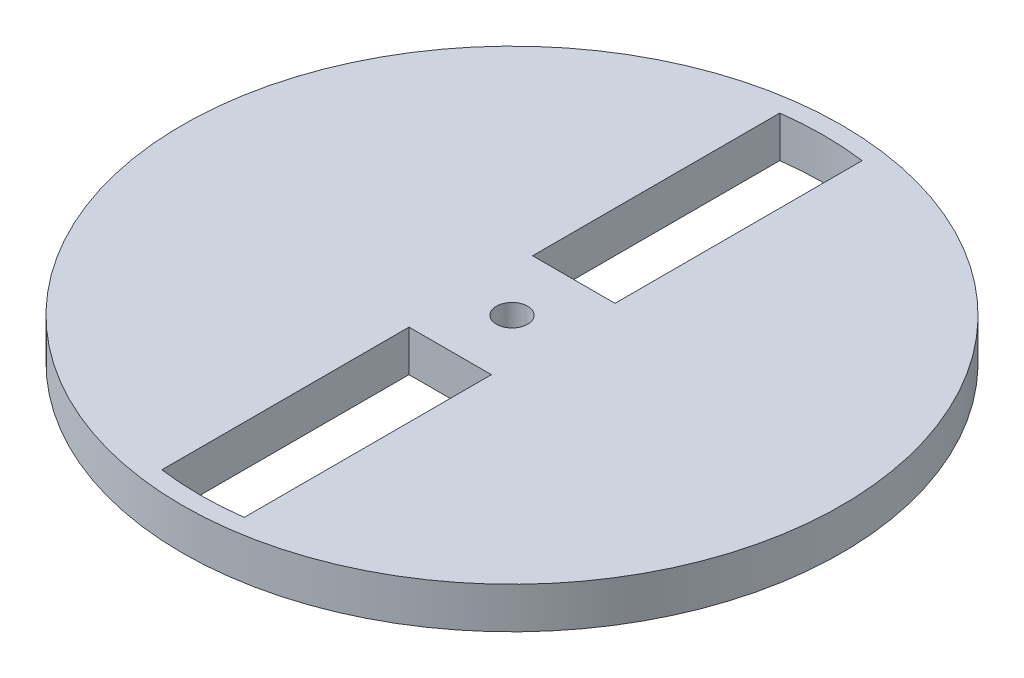
ISO-10303-21;
HEADER;
FILE_DESCRIPTION(('STEP AP214'),'2;1');
FILE_NAME('part.step','',(''),(''),'','','');
FILE_SCHEMA(('AUTOMOTIVE_DESIGN { 1 0 10303 214 1 1 1 1 }'));
ENDSEC;
DATA;
#1=APPLICATION_CONTEXT('core data for automotive mechanical design processes');
#2=APPLICATION_PROTOCOL_DEFINITION('international standard','automotive_design',2000,#1);
#3=PRODUCT_CONTEXT('',#1,'mechanical');
#4=PRODUCT('Part','Part','',(#3));
#5=PRODUCT_RELATED_PRODUCT_CATEGORY('part','',(#4));
#6=PRODUCT_DEFINITION_FORMATION('','',#4);
#7=PRODUCT_DEFINITION_CONTEXT('part definition',#1,'design');
#8=PRODUCT_DEFINITION('design','',#6,#7);
#9=PRODUCT_DEFINITION_SHAPE('','',#8);
#10=(LENGTH_UNIT() NAMED_UNIT(*) SI_UNIT(.MILLI.,.METRE.));
#11=(NAMED_UNIT(*) PLANE_ANGLE_UNIT() SI_UNIT($,.RADIAN.));
#12=(NAMED_UNIT(*) SI_UNIT($,.STERADIAN.) SOLID_ANGLE_UNIT());
#13=UNCERTAINTY_MEASURE_WITH_UNIT(LENGTH_MEASURE(1.E-05),#10,'distance_accuracy_value','');
#14=(GEOMETRIC_REPRESENTATION_CONTEXT(3) GLOBAL_UNCERTAINTY_ASSIGNED_CONTEXT((#13)) GLOBAL_UNIT_ASSIGNED_CONTEXT((#10,
#11,#12)) REPRESENTATION_CONTEXT('',''));
#15=CARTESIAN_POINT('',(0.,0.,0.));
#16=DIRECTION('',(0.,0.,1.));
#17=DIRECTION('',(1.,0.,0.));
#18=AXIS2_PLACEMENT_3D('',#15,#16,#17);
#19=CARTESIAN_POINT('',(0.,2.5,0.));
#20=DIRECTION('',(0.,1.,0.));
#21=DIRECTION('',(0.,0.,1.));
#22=AXIS2_PLACEMENT_3D('',#19,#20,#21);
#23=PLANE('',#22);
#24=CARTESIAN_POINT('',(0.,2.5,0.));
#25=DIRECTION('',(0.,1.,0.));
#26=DIRECTION('',(0.,0.,1.));
#27=AXIS2_PLACEMENT_3D('',#24,#25,#26);
#28=CIRCLE('',#27,20.);
#29=CARTESIAN_POINT('',(0.,2.5,20.));
#30=VERTEX_POINT('',#29);
#31=EDGE_CURVE('E13',#30,#30,#28,.T.);
#32=ORIENTED_EDGE('',*,*,#31,.T.);
#33=EDGE_LOOP('',(#32));
#34=FACE_BOUND('',#33,.T.);
#35=CARTESIAN_POINT('',(0.,2.5,0.));
#36=DIRECTION('',(0.,1.,0.));
#37=DIRECTION('',(0.,0.,1.));
#38=AXIS2_PLACEMENT_3D('',#35,#36,#37);
#39=CIRCLE('',#38,0.95);
#40=CARTESIAN_POINT('',(0.,2.5,0.95));
#41=VERTEX_POINT('',#40);
#42=EDGE_CURVE('E206',#41,#41,#39,.T.);
#43=ORIENTED_EDGE('',*,*,#42,.F.);
#44=EDGE_LOOP('',(#43));
#45=FACE_BOUND('',#44,.T.);
#46=DIRECTION('',(0.,0.,1.));
#47=VECTOR('',#46,1.);
#48=CARTESIAN_POINT('',(-2.5,2.5,-3.75));
#49=LINE('',#48,#47);
#50=CARTESIAN_POINT('',(-2.5,2.5,-18.75));
#51=VERTEX_POINT('',#50);
#52=CARTESIAN_POINT('',(-2.5,2.5,-3.75));
#53=VERTEX_POINT('',#52);
#54=EDGE_CURVE('E166',#51,#53,#49,.T.);
#55=ORIENTED_EDGE('',*,*,#54,.F.);
#56=CARTESIAN_POINT('',(0.,2.5,0.));
#57=DIRECTION('',(0.,1.,0.));
#58=DIRECTION('',(0.,0.,-1.));
#59=AXIS2_PLACEMENT_3D('',#56,#57,#58);
#60=CIRCLE('',#59,18.9159324380269);
#61=CARTESIAN_POINT('',(2.5,2.5,-18.75));
#62=VERTEX_POINT('',#61);
#63=EDGE_CURVE('E163',#62,#51,#60,.T.);
#64=ORIENTED_EDGE('',*,*,#63,.F.);
#65=DIRECTION('',(0.,0.,-1.));
#66=VECTOR('',#65,1.);
#67=CARTESIAN_POINT('',(2.5,2.5,-3.75));
#68=LINE('',#67,#66);
#69=CARTESIAN_POINT('',(2.5,2.5,-3.75));
#70=VERTEX_POINT('',#69);
#71=EDGE_CURVE('E174',#70,#62,#68,.T.);
#72=ORIENTED_EDGE('',*,*,#71,.F.);
#73=DIRECTION('',(1.,0.,0.));
#74=VECTOR('',#73,1.);
#75=CARTESIAN_POINT('',(-2.5,2.5,-3.75));
#76=LINE('',#75,#74);
#77=EDGE_CURVE('E170',#53,#70,#76,.T.);
#78=ORIENTED_EDGE('',*,*,#77,.F.);
#79=EDGE_LOOP('',(#55,#64,#72,#78));
#80=FACE_BOUND('',#79,.T.);
#81=DIRECTION('',(0.,0.,-1.));
#82=VECTOR('',#81,1.);
#83=CARTESIAN_POINT('',(2.5,2.5,3.75));
#84=LINE('',#83,#82);
#85=CARTESIAN_POINT('',(2.5,2.5,18.75));
#86=VERTEX_POINT('',#85);
#87=CARTESIAN_POINT('',(2.5,2.5,3.75));
#88=VERTEX_POINT('',#87);
#89=EDGE_CURVE('E124',#86,#88,#84,.T.);
#90=ORIENTED_EDGE('',*,*,#89,.F.);
#91=CARTESIAN_POINT('',(0.,2.5,0.));
#92=DIRECTION('',(0.,1.,0.));
#93=DIRECTION('',(0.,0.,1.));
#94=AXIS2_PLACEMENT_3D('',#91,#92,#93);
#95=CIRCLE('',#94,18.9159324380269);
#96=CARTESIAN_POINT('',(-2.5,2.5,18.75));
#97=VERTEX_POINT('',#96);
#98=EDGE_CURVE('E115',#97,#86,#95,.T.);
#99=ORIENTED_EDGE('',*,*,#98,.F.);
#100=DIRECTION('',(0.,0.,1.));
#101=VECTOR('',#100,1.);
#102=CARTESIAN_POINT('',(-2.5,2.5,3.75));
#103=LINE('',#102,#101);
#104=CARTESIAN_POINT('',(-2.5,2.5,3.75));
#105=VERTEX_POINT('',#104);
#106=EDGE_CURVE('E141',#105,#97,#103,.T.);
#107=ORIENTED_EDGE('',*,*,#106,.F.);
#108=DIRECTION('',(-1.,0.,0.));
#109=VECTOR('',#108,1.);
#110=CARTESIAN_POINT('',(-2.5,2.5,3.75));
#111=LINE('',#110,#109);
#112=EDGE_CURVE('E137',#88,#105,#111,.T.);
#113=ORIENTED_EDGE('',*,*,#112,.F.);
#114=EDGE_LOOP('',(#90,#99,#107,#113));
#115=FACE_BOUND('',#114,.T.);
#116=ADVANCED_FACE('F49',(#34,#45,#80,#115),#23,.T.);
#117=CARTESIAN_POINT('',(0.,0.,0.));
#118=DIRECTION('',(0.,1.,0.));
#119=DIRECTION('',(0.,0.,1.));
#120=AXIS2_PLACEMENT_3D('',#117,#118,#119);
#121=PLANE('',#120);
#122=CARTESIAN_POINT('',(0.,0.,0.));
#123=DIRECTION('',(0.,1.,0.));
#124=DIRECTION('',(0.,0.,-1.));
#125=AXIS2_PLACEMENT_3D('',#122,#123,#124);
#126=CIRCLE('',#125,18.9159324380269);
#127=CARTESIAN_POINT('',(2.5,0.,-18.75));
#128=VERTEX_POINT('',#127);
#129=CARTESIAN_POINT('',(-2.5,0.,-18.75));
#130=VERTEX_POINT('',#129);
#131=EDGE_CURVE('E133',#128,#130,#126,.T.);
#132=ORIENTED_EDGE('',*,*,#131,.T.);
#133=DIRECTION('',(0.,0.,1.));
#134=VECTOR('',#133,1.);
#135=CARTESIAN_POINT('',(-2.5,0.,-3.75));
#136=LINE('',#135,#134);
#137=CARTESIAN_POINT('',(-2.5,0.,-3.75));
#138=VERTEX_POINT('',#137);
#139=EDGE_CURVE('E181',#130,#138,#136,.T.);
#140=ORIENTED_EDGE('',*,*,#139,.T.);
#141=DIRECTION('',(1.,0.,0.));
#142=VECTOR('',#141,1.);
#143=CARTESIAN_POINT('',(-2.5,0.,-3.75));
#144=LINE('',#143,#142);
#145=CARTESIAN_POINT('',(2.5,0.,-3.75));
#146=VERTEX_POINT('',#145);
#147=EDGE_CURVE('E185',#138,#146,#144,.T.);
#148=ORIENTED_EDGE('',*,*,#147,.T.);
#149=DIRECTION('',(0.,0.,-1.));
#150=VECTOR('',#149,1.);
#151=CARTESIAN_POINT('',(2.5,0.,-3.75));
#152=LINE('',#151,#150);
#153=EDGE_CURVE('E167',#146,#128,#152,.T.);
#154=ORIENTED_EDGE('',*,*,#153,.T.);
#155=EDGE_LOOP('',(#132,#140,#148,#154));
#156=FACE_BOUND('',#155,.T.);
#157=CARTESIAN_POINT('',(0.,0.,0.));
#158=DIRECTION('',(0.,1.,0.));
#159=DIRECTION('',(0.,0.,1.));
#160=AXIS2_PLACEMENT_3D('',#157,#158,#159);
#161=CIRCLE('',#160,20.);
#162=CARTESIAN_POINT('',(0.,0.,20.));
#163=VERTEX_POINT('',#162);
#164=EDGE_CURVE('E53',#163,#163,#161,.T.);
#165=ORIENTED_EDGE('',*,*,#164,.F.);
#166=EDGE_LOOP('',(#165));
#167=FACE_BOUND('',#166,.T.);
#168=CARTESIAN_POINT('',(0.,0.,0.));
#169=DIRECTION('',(0.,1.,0.));
#170=DIRECTION('',(0.,0.,1.));
#171=AXIS2_PLACEMENT_3D('',#168,#169,#170);
#172=CIRCLE('',#171,0.95);
#173=CARTESIAN_POINT('',(0.,0.,0.95));
#174=VERTEX_POINT('',#173);
#175=EDGE_CURVE('E205',#174,#174,#172,.T.);
#176=ORIENTED_EDGE('',*,*,#175,.T.);
#177=EDGE_LOOP('',(#176));
#178=FACE_BOUND('',#177,.T.);
#179=CARTESIAN_POINT('',(0.,0.,0.));
#180=DIRECTION('',(0.,1.,0.));
#181=DIRECTION('',(0.,0.,1.));
#182=AXIS2_PLACEMENT_3D('',#179,#180,#181);
#183=CIRCLE('',#182,18.9159324380269);
#184=CARTESIAN_POINT('',(-2.5,0.,18.75));
#185=VERTEX_POINT('',#184);
#186=CARTESIAN_POINT('',(2.5,0.,18.75));
#187=VERTEX_POINT('',#186);
#188=EDGE_CURVE('E73',#185,#187,#183,.T.);
#189=ORIENTED_EDGE('',*,*,#188,.T.);
#190=DIRECTION('',(0.,0.,-1.));
#191=VECTOR('',#190,1.);
#192=CARTESIAN_POINT('',(2.5,0.,3.75));
#193=LINE('',#192,#191);
#194=CARTESIAN_POINT('',(2.5,0.,3.75));
#195=VERTEX_POINT('',#194);
#196=EDGE_CURVE('E131',#187,#195,#193,.T.);
#197=ORIENTED_EDGE('',*,*,#196,.T.);
#198=DIRECTION('',(-1.,0.,0.));
#199=VECTOR('',#198,1.);
#200=CARTESIAN_POINT('',(-2.5,0.,3.75));
#201=LINE('',#200,#199);
#202=CARTESIAN_POINT('',(-2.5,0.,3.75));
#203=VERTEX_POINT('',#202);
#204=EDGE_CURVE('E150',#195,#203,#201,.T.);
#205=ORIENTED_EDGE('',*,*,#204,.T.);
#206=DIRECTION('',(0.,0.,1.));
#207=VECTOR('',#206,1.);
#208=CARTESIAN_POINT('',(-2.5,0.,3.75));
#209=LINE('',#208,#207);
#210=EDGE_CURVE('E125',#203,#185,#209,.T.);
#211=ORIENTED_EDGE('',*,*,#210,.T.);
#212=EDGE_LOOP('',(#189,#197,#205,#211));
#213=FACE_BOUND('',#212,.T.);
#214=ADVANCED_FACE('F214',(#156,#167,#178,#213),#121,.F.);
#215=CARTESIAN_POINT('',(0.,2.5,0.));
#216=DIRECTION('',(0.,-1.,0.));
#217=DIRECTION('',(0.,0.,-1.));
#218=AXIS2_PLACEMENT_3D('',#215,#216,#217);
#219=CYLINDRICAL_SURFACE('',#218,20.);
#220=ORIENTED_EDGE('',*,*,#31,.F.);
#221=EDGE_LOOP('',(#220));
#222=FACE_BOUND('',#221,.T.);
#223=ORIENTED_EDGE('',*,*,#164,.T.);
#224=EDGE_LOOP('',(#223));
#225=FACE_BOUND('',#224,.T.);
#226=ADVANCED_FACE('F51',(#222,#225),#219,.T.);
#227=CARTESIAN_POINT('',(0.,2.5,0.));
#228=DIRECTION('',(0.,-1.,0.));
#229=DIRECTION('',(0.,0.,-1.));
#230=AXIS2_PLACEMENT_3D('',#227,#228,#229);
#231=CYLINDRICAL_SURFACE('',#230,0.95);
#232=ORIENTED_EDGE('',*,*,#42,.T.);
#233=EDGE_LOOP('',(#232));
#234=FACE_BOUND('',#233,.T.);
#235=ORIENTED_EDGE('',*,*,#175,.F.);
#236=EDGE_LOOP('',(#235));
#237=FACE_BOUND('',#236,.T.);
#238=ADVANCED_FACE('F217',(#234,#237),#231,.F.);
#239=CARTESIAN_POINT('',(0.,2.5,0.));
#240=DIRECTION('',(0.,-1.,0.));
#241=DIRECTION('',(0.,0.,-1.));
#242=AXIS2_PLACEMENT_3D('',#239,#240,#241);
#243=CYLINDRICAL_SURFACE('',#242,18.9159324380269);
#244=ORIENTED_EDGE('',*,*,#131,.F.);
#245=DIRECTION('',(0.,-1.,0.));
#246=VECTOR('',#245,1.);
#247=CARTESIAN_POINT('',(2.5,2.5,-18.75));
#248=LINE('',#247,#246);
#249=EDGE_CURVE('E177',#62,#128,#248,.T.);
#250=ORIENTED_EDGE('',*,*,#249,.F.);
#251=ORIENTED_EDGE('',*,*,#63,.T.);
#252=DIRECTION('',(0.,-1.,0.));
#253=VECTOR('',#252,1.);
#254=CARTESIAN_POINT('',(-2.5,2.5,-18.75));
#255=LINE('',#254,#253);
#256=EDGE_CURVE('E201',#51,#130,#255,.T.);
#257=ORIENTED_EDGE('',*,*,#256,.T.);
#258=EDGE_LOOP('',(#244,#250,#251,#257));
#259=FACE_BOUND('',#258,.T.);
#260=ADVANCED_FACE('F219',(#259),#243,.F.);
#261=CARTESIAN_POINT('',(-2.5,2.5,-3.75));
#262=DIRECTION('',(1.,0.,0.));
#263=DIRECTION('',(0.,0.,-1.));
#264=AXIS2_PLACEMENT_3D('',#261,#262,#263);
#265=PLANE('',#264);
#266=ORIENTED_EDGE('',*,*,#139,.F.);
#267=ORIENTED_EDGE('',*,*,#256,.F.);
#268=ORIENTED_EDGE('',*,*,#54,.T.);
#269=DIRECTION('',(0.,-1.,0.));
#270=VECTOR('',#269,1.);
#271=CARTESIAN_POINT('',(-2.5,2.5,-3.75));
#272=LINE('',#271,#270);
#273=EDGE_CURVE('E198',#53,#138,#272,.T.);
#274=ORIENTED_EDGE('',*,*,#273,.T.);
#275=EDGE_LOOP('',(#266,#267,#268,#274));
#276=FACE_BOUND('',#275,.T.);
#277=ADVANCED_FACE('F226',(#276),#265,.T.);
#278=CARTESIAN_POINT('',(-2.5,2.5,-3.75));
#279=DIRECTION('',(0.,0.,-1.));
#280=DIRECTION('',(-1.,0.,0.));
#281=AXIS2_PLACEMENT_3D('',#278,#279,#280);
#282=PLANE('',#281);
#283=ORIENTED_EDGE('',*,*,#147,.F.);
#284=ORIENTED_EDGE('',*,*,#273,.F.);
#285=ORIENTED_EDGE('',*,*,#77,.T.);
#286=DIRECTION('',(0.,-1.,0.));
#287=VECTOR('',#286,1.);
#288=CARTESIAN_POINT('',(2.5,2.5,-3.75));
#289=LINE('',#288,#287);
#290=EDGE_CURVE('E195',#70,#146,#289,.T.);
#291=ORIENTED_EDGE('',*,*,#290,.T.);
#292=EDGE_LOOP('',(#283,#284,#285,#291));
#293=FACE_BOUND('',#292,.T.);
#294=ADVANCED_FACE('F250',(#293),#282,.T.);
#295=CARTESIAN_POINT('',(2.5,2.5,-3.75));
#296=DIRECTION('',(-1.,0.,0.));
#297=DIRECTION('',(0.,0.,1.));
#298=AXIS2_PLACEMENT_3D('',#295,#296,#297);
#299=PLANE('',#298);
#300=ORIENTED_EDGE('',*,*,#153,.F.);
#301=ORIENTED_EDGE('',*,*,#290,.F.);
#302=ORIENTED_EDGE('',*,*,#71,.T.);
#303=ORIENTED_EDGE('',*,*,#249,.T.);
#304=EDGE_LOOP('',(#300,#301,#302,#303));
#305=FACE_BOUND('',#304,.T.);
#306=ADVANCED_FACE('F255',(#305),#299,.T.);
#307=CARTESIAN_POINT('',(0.,2.5,0.));
#308=DIRECTION('',(0.,-1.,0.));
#309=DIRECTION('',(0.,0.,-1.));
#310=AXIS2_PLACEMENT_3D('',#307,#308,#309);
#311=CYLINDRICAL_SURFACE('',#310,18.9159324380269);
#312=ORIENTED_EDGE('',*,*,#188,.F.);
#313=DIRECTION('',(0.,-1.,0.));
#314=VECTOR('',#313,1.);
#315=CARTESIAN_POINT('',(-2.5,2.5,18.75));
#316=LINE('',#315,#314);
#317=EDGE_CURVE('E119',#97,#185,#316,.T.);
#318=ORIENTED_EDGE('',*,*,#317,.F.);
#319=ORIENTED_EDGE('',*,*,#98,.T.);
#320=DIRECTION('',(0.,-1.,0.));
#321=VECTOR('',#320,1.);
#322=CARTESIAN_POINT('',(2.5,2.5,18.75));
#323=LINE('',#322,#321);
#324=EDGE_CURVE('E118',#86,#187,#323,.T.);
#325=ORIENTED_EDGE('',*,*,#324,.T.);
#326=EDGE_LOOP('',(#312,#318,#319,#325));
#327=FACE_BOUND('',#326,.T.);
#328=ADVANCED_FACE('F117',(#327),#311,.F.);
#329=CARTESIAN_POINT('',(2.5,2.5,3.75));
#330=DIRECTION('',(-1.,0.,0.));
#331=DIRECTION('',(0.,0.,1.));
#332=AXIS2_PLACEMENT_3D('',#329,#330,#331);
#333=PLANE('',#332);
#334=ORIENTED_EDGE('',*,*,#196,.F.);
#335=ORIENTED_EDGE('',*,*,#324,.F.);
#336=ORIENTED_EDGE('',*,*,#89,.T.);
#337=DIRECTION('',(0.,-1.,0.));
#338=VECTOR('',#337,1.);
#339=CARTESIAN_POINT('',(2.5,2.5,3.75));
#340=LINE('',#339,#338);
#341=EDGE_CURVE('E134',#88,#195,#340,.T.);
#342=ORIENTED_EDGE('',*,*,#341,.T.);
#343=EDGE_LOOP('',(#334,#335,#336,#342));
#344=FACE_BOUND('',#343,.T.);
#345=ADVANCED_FACE('F128',(#344),#333,.T.);
#346=CARTESIAN_POINT('',(-2.5,2.5,3.75));
#347=DIRECTION('',(0.,0.,1.));
#348=DIRECTION('',(1.,0.,0.));
#349=AXIS2_PLACEMENT_3D('',#346,#347,#348);
#350=PLANE('',#349);
#351=ORIENTED_EDGE('',*,*,#204,.F.);
#352=ORIENTED_EDGE('',*,*,#341,.F.);
#353=ORIENTED_EDGE('',*,*,#112,.T.);
#354=DIRECTION('',(0.,-1.,0.));
#355=VECTOR('',#354,1.);
#356=CARTESIAN_POINT('',(-2.5,2.5,3.75));
#357=LINE('',#356,#355);
#358=EDGE_CURVE('E65',#105,#203,#357,.T.);
#359=ORIENTED_EDGE('',*,*,#358,.T.);
#360=EDGE_LOOP('',(#351,#352,#353,#359));
#361=FACE_BOUND('',#360,.T.);
#362=ADVANCED_FACE('F294',(#361),#350,.T.);
#363=CARTESIAN_POINT('',(-2.5,2.5,3.75));
#364=DIRECTION('',(1.,0.,0.));
#365=DIRECTION('',(0.,0.,-1.));
#366=AXIS2_PLACEMENT_3D('',#363,#364,#365);
#367=PLANE('',#366);
#368=ORIENTED_EDGE('',*,*,#210,.F.);
#369=ORIENTED_EDGE('',*,*,#358,.F.);
#370=ORIENTED_EDGE('',*,*,#106,.T.);
#371=ORIENTED_EDGE('',*,*,#317,.T.);
#372=EDGE_LOOP('',(#368,#369,#370,#371));
#373=FACE_BOUND('',#372,.T.);
#374=ADVANCED_FACE('F302',(#373),#367,.T.);
#375=CLOSED_SHELL('',(#116,#214,#226,#238,#260,#277,#294,#306,#328,#345,#362,#374));
#376=MANIFOLD_SOLID_BREP('B2',#375);
#377=ADVANCED_BREP_SHAPE_REPRESENTATION('',(#18,#376),#14);
#378=SHAPE_DEFINITION_REPRESENTATION(#9,#377);
ENDSEC;
END-ISO-10303-21;
